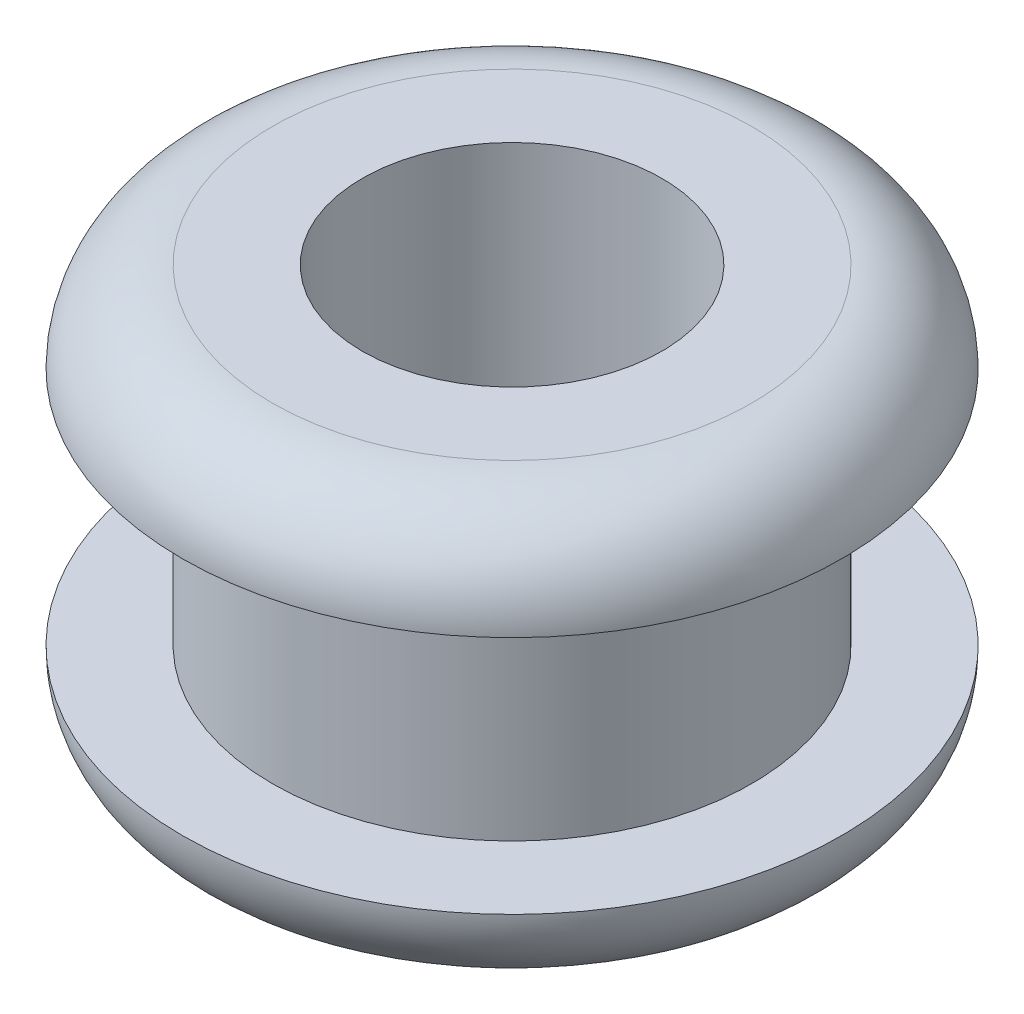
ISO-10303-21;
HEADER;
FILE_DESCRIPTION(('STEP AP214'),'2;1');
FILE_NAME('part.step','',(''),(''),'','','');
FILE_SCHEMA(('AUTOMOTIVE_DESIGN { 1 0 10303 214 1 1 1 1 }'));
ENDSEC;
DATA;
#1=APPLICATION_CONTEXT('core data for automotive mechanical design processes');
#2=APPLICATION_PROTOCOL_DEFINITION('international standard','automotive_design',2000,#1);
#3=PRODUCT_CONTEXT('',#1,'mechanical');
#4=PRODUCT('Part','Part','',(#3));
#5=PRODUCT_RELATED_PRODUCT_CATEGORY('part','',(#4));
#6=PRODUCT_DEFINITION_FORMATION('','',#4);
#7=PRODUCT_DEFINITION_CONTEXT('part definition',#1,'design');
#8=PRODUCT_DEFINITION('design','',#6,#7);
#9=PRODUCT_DEFINITION_SHAPE('','',#8);
#10=(LENGTH_UNIT() NAMED_UNIT(*) SI_UNIT(.MILLI.,.METRE.));
#11=(NAMED_UNIT(*) PLANE_ANGLE_UNIT() SI_UNIT($,.RADIAN.));
#12=(NAMED_UNIT(*) SI_UNIT($,.STERADIAN.) SOLID_ANGLE_UNIT());
#13=UNCERTAINTY_MEASURE_WITH_UNIT(LENGTH_MEASURE(1.E-05),#10,'distance_accuracy_value','');
#14=(GEOMETRIC_REPRESENTATION_CONTEXT(3) GLOBAL_UNCERTAINTY_ASSIGNED_CONTEXT((#13)) GLOBAL_UNIT_ASSIGNED_CONTEXT((#10,
#11,#12)) REPRESENTATION_CONTEXT('',''));
#15=CARTESIAN_POINT('',(0.,0.,0.));
#16=DIRECTION('',(0.,0.,1.));
#17=DIRECTION('',(1.,0.,0.));
#18=AXIS2_PLACEMENT_3D('',#15,#16,#17);
#19=CARTESIAN_POINT('',(0.,0.,0.));
#20=DIRECTION('',(0.,1.,0.));
#21=DIRECTION('',(0.,0.,1.));
#22=AXIS2_PLACEMENT_3D('',#19,#20,#21);
#23=CYLINDRICAL_SURFACE('',#22,3.96875);
#24=CARTESIAN_POINT('',(0.,-11.1125000000001,0.));
#25=DIRECTION('',(0.,1.,0.));
#26=DIRECTION('',(0.,0.,1.));
#27=AXIS2_PLACEMENT_3D('',#24,#25,#26);
#28=CIRCLE('',#27,3.96875);
#29=CARTESIAN_POINT('',(0.,-11.1125000000001,3.96875));
#30=VERTEX_POINT('',#29);
#31=EDGE_CURVE('E68',#30,#30,#28,.T.);
#32=ORIENTED_EDGE('',*,*,#31,.F.);
#33=EDGE_LOOP('',(#32));
#34=FACE_BOUND('',#33,.T.);
#35=CARTESIAN_POINT('',(0.,0.,0.));
#36=DIRECTION('',(0.,1.,0.));
#37=DIRECTION('',(0.,0.,1.));
#38=AXIS2_PLACEMENT_3D('',#35,#36,#37);
#39=CIRCLE('',#38,3.96875);
#40=CARTESIAN_POINT('',(0.,0.,3.96875));
#41=VERTEX_POINT('',#40);
#42=EDGE_CURVE('E12',#41,#41,#39,.T.);
#43=ORIENTED_EDGE('',*,*,#42,.T.);
#44=EDGE_LOOP('',(#43));
#45=FACE_BOUND('',#44,.T.);
#46=ADVANCED_FACE('F40',(#34,#45),#23,.F.);
#47=CARTESIAN_POINT('',(3.96875000000002,0.,0.));
#48=DIRECTION('',(0.,-1.,0.));
#49=DIRECTION('',(0.,0.,-1.));
#50=AXIS2_PLACEMENT_3D('',#47,#48,#49);
#51=PLANE('',#50);
#52=ORIENTED_EDGE('',*,*,#42,.F.);
#53=EDGE_LOOP('',(#52));
#54=FACE_BOUND('',#53,.T.);
#55=CARTESIAN_POINT('',(0.,0.,0.));
#56=DIRECTION('',(0.,1.,0.));
#57=DIRECTION('',(0.,0.,1.));
#58=AXIS2_PLACEMENT_3D('',#55,#56,#57);
#59=CIRCLE('',#58,6.35);
#60=CARTESIAN_POINT('',(0.,0.,6.35));
#61=VERTEX_POINT('',#60);
#62=EDGE_CURVE('E46',#61,#61,#59,.T.);
#63=ORIENTED_EDGE('',*,*,#62,.T.);
#64=EDGE_LOOP('',(#63));
#65=FACE_BOUND('',#64,.T.);
#66=ADVANCED_FACE('F75',(#54,#65),#51,.F.);
#67=CARTESIAN_POINT('',(0.,-2.38125,0.));
#68=DIRECTION('',(0.,1.,0.));
#69=DIRECTION('',(0.,0.,1.));
#70=AXIS2_PLACEMENT_3D('',#67,#68,#69);
#71=TOROIDAL_SURFACE('',#70,6.35,2.38125);
#72=ORIENTED_EDGE('',*,*,#62,.F.);
#73=EDGE_LOOP('',(#72));
#74=FACE_BOUND('',#73,.T.);
#75=CARTESIAN_POINT('',(0.,-2.38125,0.));
#76=DIRECTION('',(0.,1.,0.));
#77=DIRECTION('',(0.,0.,1.));
#78=AXIS2_PLACEMENT_3D('',#75,#76,#77);
#79=CIRCLE('',#78,8.73125);
#80=CARTESIAN_POINT('',(0.,-2.38125,8.73125));
#81=VERTEX_POINT('',#80);
#82=EDGE_CURVE('E50',#81,#81,#79,.T.);
#83=ORIENTED_EDGE('',*,*,#82,.T.);
#84=EDGE_LOOP('',(#83));
#85=FACE_BOUND('',#84,.T.);
#86=ADVANCED_FACE('F79',(#74,#85),#71,.T.);
#87=CARTESIAN_POINT('',(8.73124999999997,-2.38125,0.));
#88=DIRECTION('',(0.,1.,0.));
#89=DIRECTION('',(0.,0.,1.));
#90=AXIS2_PLACEMENT_3D('',#87,#88,#89);
#91=PLANE('',#90);
#92=ORIENTED_EDGE('',*,*,#82,.F.);
#93=EDGE_LOOP('',(#92));
#94=FACE_BOUND('',#93,.T.);
#95=CARTESIAN_POINT('',(0.,-2.38125,0.));
#96=DIRECTION('',(0.,1.,0.));
#97=DIRECTION('',(0.,0.,1.));
#98=AXIS2_PLACEMENT_3D('',#95,#96,#97);
#99=CIRCLE('',#98,6.35);
#100=CARTESIAN_POINT('',(0.,-2.38125,6.35));
#101=VERTEX_POINT('',#100);
#102=EDGE_CURVE('E54',#101,#101,#99,.T.);
#103=ORIENTED_EDGE('',*,*,#102,.T.);
#104=EDGE_LOOP('',(#103));
#105=FACE_BOUND('',#104,.T.);
#106=ADVANCED_FACE('F84',(#94,#105),#91,.F.);
#107=CARTESIAN_POINT('',(0.,0.,0.));
#108=DIRECTION('',(0.,1.,0.));
#109=DIRECTION('',(0.,0.,1.));
#110=AXIS2_PLACEMENT_3D('',#107,#108,#109);
#111=CYLINDRICAL_SURFACE('',#110,6.35);
#112=ORIENTED_EDGE('',*,*,#102,.F.);
#113=EDGE_LOOP('',(#112));
#114=FACE_BOUND('',#113,.T.);
#115=CARTESIAN_POINT('',(0.,-8.73125000000008,0.));
#116=DIRECTION('',(0.,1.,0.));
#117=DIRECTION('',(0.,0.,1.));
#118=AXIS2_PLACEMENT_3D('',#115,#116,#117);
#119=CIRCLE('',#118,6.35);
#120=CARTESIAN_POINT('',(0.,-8.73125000000008,6.35));
#121=VERTEX_POINT('',#120);
#122=EDGE_CURVE('E59',#121,#121,#119,.T.);
#123=ORIENTED_EDGE('',*,*,#122,.T.);
#124=EDGE_LOOP('',(#123));
#125=FACE_BOUND('',#124,.T.);
#126=ADVANCED_FACE('F90',(#114,#125),#111,.T.);
#127=CARTESIAN_POINT('',(6.34999999999997,-8.73125000000008,0.));
#128=DIRECTION('',(0.,-1.,0.));
#129=DIRECTION('',(0.,0.,-1.));
#130=AXIS2_PLACEMENT_3D('',#127,#128,#129);
#131=PLANE('',#130);
#132=ORIENTED_EDGE('',*,*,#122,.F.);
#133=EDGE_LOOP('',(#132));
#134=FACE_BOUND('',#133,.T.);
#135=CARTESIAN_POINT('',(0.,-8.73125000000008,0.));
#136=DIRECTION('',(0.,1.,0.));
#137=DIRECTION('',(0.,0.,1.));
#138=AXIS2_PLACEMENT_3D('',#135,#136,#137);
#139=CIRCLE('',#138,8.73125);
#140=CARTESIAN_POINT('',(0.,-8.73125000000008,8.73125));
#141=VERTEX_POINT('',#140);
#142=EDGE_CURVE('E62',#141,#141,#139,.T.);
#143=ORIENTED_EDGE('',*,*,#142,.T.);
#144=EDGE_LOOP('',(#143));
#145=FACE_BOUND('',#144,.T.);
#146=ADVANCED_FACE('F94',(#134,#145),#131,.F.);
#147=CARTESIAN_POINT('',(0.,-8.73125000000008,0.));
#148=DIRECTION('',(0.,1.,0.));
#149=DIRECTION('',(0.,0.,1.));
#150=AXIS2_PLACEMENT_3D('',#147,#148,#149);
#151=TOROIDAL_SURFACE('',#150,6.35,2.38125);
#152=ORIENTED_EDGE('',*,*,#142,.F.);
#153=EDGE_LOOP('',(#152));
#154=FACE_BOUND('',#153,.T.);
#155=CARTESIAN_POINT('',(0.,-11.1125000000001,0.));
#156=DIRECTION('',(0.,1.,0.));
#157=DIRECTION('',(0.,0.,1.));
#158=AXIS2_PLACEMENT_3D('',#155,#156,#157);
#159=CIRCLE('',#158,6.35);
#160=CARTESIAN_POINT('',(0.,-11.1125000000001,6.35));
#161=VERTEX_POINT('',#160);
#162=EDGE_CURVE('E65',#161,#161,#159,.T.);
#163=ORIENTED_EDGE('',*,*,#162,.T.);
#164=EDGE_LOOP('',(#163));
#165=FACE_BOUND('',#164,.T.);
#166=ADVANCED_FACE('F98',(#154,#165),#151,.T.);
#167=CARTESIAN_POINT('',(6.34999999999997,-11.1125000000001,0.));
#168=DIRECTION('',(0.,1.,0.));
#169=DIRECTION('',(0.,0.,1.));
#170=AXIS2_PLACEMENT_3D('',#167,#168,#169);
#171=PLANE('',#170);
#172=ORIENTED_EDGE('',*,*,#162,.F.);
#173=EDGE_LOOP('',(#172));
#174=FACE_BOUND('',#173,.T.);
#175=ORIENTED_EDGE('',*,*,#31,.T.);
#176=EDGE_LOOP('',(#175));
#177=FACE_BOUND('',#176,.T.);
#178=ADVANCED_FACE('F72',(#174,#177),#171,.F.);
#179=CLOSED_SHELL('',(#46,#66,#86,#106,#126,#146,#166,#178));
#180=MANIFOLD_SOLID_BREP('B2',#179);
#181=ADVANCED_BREP_SHAPE_REPRESENTATION('',(#18,#180),#14);
#182=SHAPE_DEFINITION_REPRESENTATION(#9,#181);
ENDSEC;
END-ISO-10303-21;
